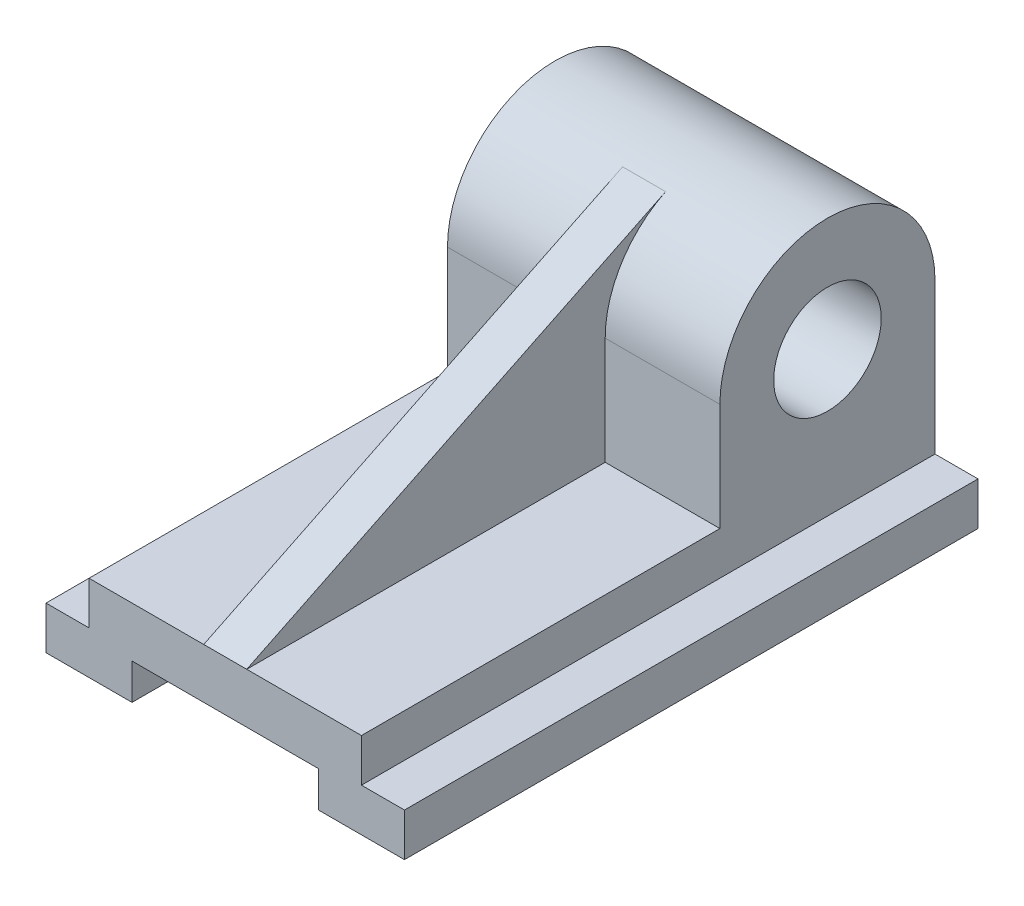
ISO-10303-21;
HEADER;
FILE_DESCRIPTION(('STEP AP214'),'2;1');
FILE_NAME('part.step','',(''),(''),'','','');
FILE_SCHEMA(('AUTOMOTIVE_DESIGN { 1 0 10303 214 1 1 1 1 }'));
ENDSEC;
DATA;
#1=APPLICATION_CONTEXT('core data for automotive mechanical design processes');
#2=APPLICATION_PROTOCOL_DEFINITION('international standard','automotive_design',2000,#1);
#3=PRODUCT_CONTEXT('',#1,'mechanical');
#4=PRODUCT('Part','Part','',(#3));
#5=PRODUCT_RELATED_PRODUCT_CATEGORY('part','',(#4));
#6=PRODUCT_DEFINITION_FORMATION('','',#4);
#7=PRODUCT_DEFINITION_CONTEXT('part definition',#1,'design');
#8=PRODUCT_DEFINITION('design','',#6,#7);
#9=PRODUCT_DEFINITION_SHAPE('','',#8);
#10=(LENGTH_UNIT() NAMED_UNIT(*) SI_UNIT(.MILLI.,.METRE.));
#11=(NAMED_UNIT(*) PLANE_ANGLE_UNIT() SI_UNIT($,.RADIAN.));
#12=(NAMED_UNIT(*) SI_UNIT($,.STERADIAN.) SOLID_ANGLE_UNIT());
#13=UNCERTAINTY_MEASURE_WITH_UNIT(LENGTH_MEASURE(1.E-05),#10,'distance_accuracy_value','');
#14=(GEOMETRIC_REPRESENTATION_CONTEXT(3) GLOBAL_UNCERTAINTY_ASSIGNED_CONTEXT((#13)) GLOBAL_UNIT_ASSIGNED_CONTEXT((#10,
#11,#12)) REPRESENTATION_CONTEXT('',''));
#15=CARTESIAN_POINT('',(0.,0.,0.));
#16=DIRECTION('',(0.,0.,1.));
#17=DIRECTION('',(1.,0.,0.));
#18=AXIS2_PLACEMENT_3D('',#15,#16,#17);
#19=CARTESIAN_POINT('',(-50.,12.,160.));
#20=DIRECTION('',(0.,-1.,0.));
#21=DIRECTION('',(0.,0.,-1.));
#22=AXIS2_PLACEMENT_3D('',#19,#20,#21);
#23=PLANE('',#22);
#24=DIRECTION('',(0.,0.,1.));
#25=VECTOR('',#24,1.);
#26=CARTESIAN_POINT('',(-6.,12.,160.));
#27=LINE('',#26,#25);
#28=CARTESIAN_POINT('',(-6.,12.,60.));
#29=VERTEX_POINT('',#28);
#30=CARTESIAN_POINT('',(-6.,12.,160.));
#31=VERTEX_POINT('',#30);
#32=EDGE_CURVE('E177',#29,#31,#27,.T.);
#33=ORIENTED_EDGE('',*,*,#32,.F.);
#34=DIRECTION('',(1.,0.,0.));
#35=VECTOR('',#34,1.);
#36=CARTESIAN_POINT('',(-38.,12.,60.));
#37=LINE('',#36,#35);
#38=CARTESIAN_POINT('',(-38.,12.,60.));
#39=VERTEX_POINT('',#38);
#40=EDGE_CURVE('E164',#39,#29,#37,.T.);
#41=ORIENTED_EDGE('',*,*,#40,.F.);
#42=DIRECTION('',(0.,0.,1.));
#43=VECTOR('',#42,1.);
#44=CARTESIAN_POINT('',(-38.,12.,0.));
#45=LINE('',#44,#43);
#46=CARTESIAN_POINT('',(-38.,12.,160.));
#47=VERTEX_POINT('',#46);
#48=EDGE_CURVE('E242',#39,#47,#45,.T.);
#49=ORIENTED_EDGE('',*,*,#48,.T.);
#50=DIRECTION('',(-1.,0.,0.));
#51=VECTOR('',#50,1.);
#52=CARTESIAN_POINT('',(-50.,12.,160.));
#53=LINE('',#52,#51);
#54=EDGE_CURVE('E179',#31,#47,#53,.T.);
#55=ORIENTED_EDGE('',*,*,#54,.F.);
#56=EDGE_LOOP('',(#33,#41,#49,#55));
#57=FACE_BOUND('',#56,.T.);
#58=ADVANCED_FACE('F41',(#57),#23,.F.);
#59=CARTESIAN_POINT('',(-38.,72.,60.));
#60=DIRECTION('',(0.,0.,-1.));
#61=DIRECTION('',(-1.,0.,0.));
#62=AXIS2_PLACEMENT_3D('',#59,#60,#61);
#63=PLANE('',#62);
#64=DIRECTION('',(0.,-1.,0.));
#65=VECTOR('',#64,1.);
#66=CARTESIAN_POINT('',(-6.,72.,60.));
#67=LINE('',#66,#65);
#68=CARTESIAN_POINT('',(-6.,42.,60.));
#69=VERTEX_POINT('',#68);
#70=EDGE_CURVE('E166',#69,#29,#67,.T.);
#71=ORIENTED_EDGE('',*,*,#70,.F.);
#72=DIRECTION('',(-1.,0.,0.));
#73=VECTOR('',#72,1.);
#74=CARTESIAN_POINT('',(38.,42.,60.));
#75=LINE('',#74,#73);
#76=CARTESIAN_POINT('',(-38.,42.,60.));
#77=VERTEX_POINT('',#76);
#78=EDGE_CURVE('E297',#69,#77,#75,.T.);
#79=ORIENTED_EDGE('',*,*,#78,.T.);
#80=DIRECTION('',(0.,-1.,0.));
#81=VECTOR('',#80,1.);
#82=CARTESIAN_POINT('',(-38.,72.,60.));
#83=LINE('',#82,#81);
#84=EDGE_CURVE('E172',#77,#39,#83,.T.);
#85=ORIENTED_EDGE('',*,*,#84,.T.);
#86=ORIENTED_EDGE('',*,*,#40,.T.);
#87=EDGE_LOOP('',(#71,#79,#85,#86));
#88=FACE_BOUND('',#87,.T.);
#89=ADVANCED_FACE('F170',(#88),#63,.F.);
#90=CARTESIAN_POINT('',(38.,42.,30.));
#91=DIRECTION('',(1.,0.,0.));
#92=DIRECTION('',(0.,0.,-1.));
#93=AXIS2_PLACEMENT_3D('',#90,#91,#92);
#94=CYLINDRICAL_SURFACE('',#93,30.);
#95=CARTESIAN_POINT('',(38.,42.,30.));
#96=DIRECTION('',(-1.,0.,0.));
#97=DIRECTION('',(0.,0.,1.));
#98=AXIS2_PLACEMENT_3D('',#95,#96,#97);
#99=CIRCLE('',#98,30.);
#100=CARTESIAN_POINT('',(38.,42.,0.));
#101=VERTEX_POINT('',#100);
#102=CARTESIAN_POINT('',(38.,42.,60.));
#103=VERTEX_POINT('',#102);
#104=EDGE_CURVE('E51',#101,#103,#99,.F.);
#105=ORIENTED_EDGE('',*,*,#104,.F.);
#106=DIRECTION('',(-1.,0.,0.));
#107=VECTOR('',#106,1.);
#108=CARTESIAN_POINT('',(38.,42.,0.));
#109=LINE('',#108,#107);
#110=CARTESIAN_POINT('',(-38.,42.,0.));
#111=VERTEX_POINT('',#110);
#112=EDGE_CURVE('E298',#111,#101,#109,.F.);
#113=ORIENTED_EDGE('',*,*,#112,.F.);
#114=CARTESIAN_POINT('',(-38.,42.,30.));
#115=DIRECTION('',(1.,0.,0.));
#116=DIRECTION('',(0.,0.,-1.));
#117=AXIS2_PLACEMENT_3D('',#114,#115,#116);
#118=CIRCLE('',#117,30.);
#119=EDGE_CURVE('E11',#77,#111,#118,.F.);
#120=ORIENTED_EDGE('',*,*,#119,.F.);
#121=ORIENTED_EDGE('',*,*,#78,.F.);
#122=CARTESIAN_POINT('',(-6.,42.,30.));
#123=DIRECTION('',(1.,0.,0.));
#124=DIRECTION('',(0.,0.,-1.));
#125=AXIS2_PLACEMENT_3D('',#122,#123,#124);
#126=CIRCLE('',#125,30.);
#127=CARTESIAN_POINT('',(-6.,68.9662921348059,43.1460674157097));
#128=VERTEX_POINT('',#127);
#129=EDGE_CURVE('E65',#69,#128,#126,.F.);
#130=ORIENTED_EDGE('',*,*,#129,.T.);
#131=DIRECTION('',(1.,0.,0.));
#132=VECTOR('',#131,1.);
#133=CARTESIAN_POINT('',(38.,68.9662921348203,43.1460674157167));
#134=LINE('',#133,#132);
#135=CARTESIAN_POINT('',(6.,68.9662921348059,43.1460674157097));
#136=VERTEX_POINT('',#135);
#137=EDGE_CURVE('E59',#128,#136,#134,.T.);
#138=ORIENTED_EDGE('',*,*,#137,.T.);
#139=CARTESIAN_POINT('',(6.,42.,30.));
#140=DIRECTION('',(1.,0.,0.));
#141=DIRECTION('',(0.,0.,-1.));
#142=AXIS2_PLACEMENT_3D('',#139,#140,#141);
#143=CIRCLE('',#142,30.);
#144=CARTESIAN_POINT('',(6.,42.,60.));
#145=VERTEX_POINT('',#144);
#146=EDGE_CURVE('E200',#145,#136,#143,.F.);
#147=ORIENTED_EDGE('',*,*,#146,.F.);
#148=EDGE_CURVE('E299',#103,#145,#75,.T.);
#149=ORIENTED_EDGE('',*,*,#148,.F.);
#150=EDGE_LOOP('',(#105,#113,#120,#121,#130,#138,#147,#149));
#151=FACE_BOUND('',#150,.T.);
#152=ADVANCED_FACE('F42',(#151),#94,.T.);
#153=CARTESIAN_POINT('',(6.,12.,60.));
#154=VERTEX_POINT('',#153);
#155=CARTESIAN_POINT('',(38.,12.,60.));
#156=VERTEX_POINT('',#155);
#157=EDGE_CURVE('E176',#154,#156,#37,.T.);
#158=ORIENTED_EDGE('',*,*,#157,.F.);
#159=DIRECTION('',(0.,0.,1.));
#160=VECTOR('',#159,1.);
#161=CARTESIAN_POINT('',(6.,12.,160.));
#162=LINE('',#161,#160);
#163=CARTESIAN_POINT('',(6.,12.,160.));
#164=VERTEX_POINT('',#163);
#165=EDGE_CURVE('E197',#154,#164,#162,.T.);
#166=ORIENTED_EDGE('',*,*,#165,.T.);
#167=CARTESIAN_POINT('',(38.,12.,160.));
#168=VERTEX_POINT('',#167);
#169=EDGE_CURVE('E272',#168,#164,#53,.T.);
#170=ORIENTED_EDGE('',*,*,#169,.F.);
#171=DIRECTION('',(0.,0.,1.));
#172=VECTOR('',#171,1.);
#173=CARTESIAN_POINT('',(38.,12.,0.));
#174=LINE('',#173,#172);
#175=EDGE_CURVE('E255',#156,#168,#174,.T.);
#176=ORIENTED_EDGE('',*,*,#175,.F.);
#177=EDGE_LOOP('',(#158,#166,#170,#176));
#178=FACE_BOUND('',#177,.T.);
#179=ADVANCED_FACE('F336',(#178),#23,.F.);
#180=CARTESIAN_POINT('',(-50.,12.,160.));
#181=DIRECTION('',(1.,0.,0.));
#182=DIRECTION('',(0.,1.,0.));
#183=AXIS2_PLACEMENT_3D('',#180,#181,#182);
#184=PLANE('',#183);
#185=DIRECTION('',(0.,0.,1.));
#186=VECTOR('',#185,1.);
#187=CARTESIAN_POINT('',(-50.,0.,0.));
#188=LINE('',#187,#186);
#189=CARTESIAN_POINT('',(-50.,0.,0.));
#190=VERTEX_POINT('',#189);
#191=CARTESIAN_POINT('',(-50.,0.,160.));
#192=VERTEX_POINT('',#191);
#193=EDGE_CURVE('E237',#190,#192,#188,.T.);
#194=ORIENTED_EDGE('',*,*,#193,.F.);
#195=DIRECTION('',(0.,-1.,0.));
#196=VECTOR('',#195,1.);
#197=CARTESIAN_POINT('',(-50.,12.,0.));
#198=LINE('',#197,#196);
#199=CARTESIAN_POINT('',(-50.,-12.,0.));
#200=VERTEX_POINT('',#199);
#201=EDGE_CURVE('E286',#190,#200,#198,.T.);
#202=ORIENTED_EDGE('',*,*,#201,.T.);
#203=DIRECTION('',(0.,0.,-1.));
#204=VECTOR('',#203,1.);
#205=CARTESIAN_POINT('',(-50.,-12.,160.));
#206=LINE('',#205,#204);
#207=CARTESIAN_POINT('',(-50.,-12.,160.));
#208=VERTEX_POINT('',#207);
#209=EDGE_CURVE('E291',#208,#200,#206,.T.);
#210=ORIENTED_EDGE('',*,*,#209,.F.);
#211=DIRECTION('',(0.,-1.,0.));
#212=VECTOR('',#211,1.);
#213=CARTESIAN_POINT('',(-50.,12.,160.));
#214=LINE('',#213,#212);
#215=EDGE_CURVE('E277',#192,#208,#214,.T.);
#216=ORIENTED_EDGE('',*,*,#215,.F.);
#217=EDGE_LOOP('',(#194,#202,#210,#216));
#218=FACE_BOUND('',#217,.T.);
#219=ADVANCED_FACE('F347',(#218),#184,.F.);
#220=CARTESIAN_POINT('',(-50.,-12.,160.));
#221=DIRECTION('',(0.,1.,0.));
#222=DIRECTION('',(0.,0.,1.));
#223=AXIS2_PLACEMENT_3D('',#220,#221,#222);
#224=PLANE('',#223);
#225=DIRECTION('',(0.,0.,1.));
#226=VECTOR('',#225,1.);
#227=CARTESIAN_POINT('',(26.,-12.,0.));
#228=LINE('',#227,#226);
#229=CARTESIAN_POINT('',(26.,-12.,0.));
#230=VERTEX_POINT('',#229);
#231=CARTESIAN_POINT('',(26.,-12.,160.));
#232=VERTEX_POINT('',#231);
#233=EDGE_CURVE('E235',#230,#232,#228,.T.);
#234=ORIENTED_EDGE('',*,*,#233,.F.);
#235=DIRECTION('',(1.,0.,0.));
#236=VECTOR('',#235,1.);
#237=CARTESIAN_POINT('',(-50.,-12.,0.));
#238=LINE('',#237,#236);
#239=CARTESIAN_POINT('',(50.,-12.,0.));
#240=VERTEX_POINT('',#239);
#241=EDGE_CURVE('E288',#230,#240,#238,.T.);
#242=ORIENTED_EDGE('',*,*,#241,.T.);
#243=DIRECTION('',(0.,0.,-1.));
#244=VECTOR('',#243,1.);
#245=CARTESIAN_POINT('',(50.,-12.,160.));
#246=LINE('',#245,#244);
#247=CARTESIAN_POINT('',(50.,-12.,160.));
#248=VERTEX_POINT('',#247);
#249=EDGE_CURVE('E285',#248,#240,#246,.T.);
#250=ORIENTED_EDGE('',*,*,#249,.F.);
#251=DIRECTION('',(1.,0.,0.));
#252=VECTOR('',#251,1.);
#253=CARTESIAN_POINT('',(-50.,-12.,160.));
#254=LINE('',#253,#252);
#255=EDGE_CURVE('E276',#232,#248,#254,.T.);
#256=ORIENTED_EDGE('',*,*,#255,.F.);
#257=EDGE_LOOP('',(#234,#242,#250,#256));
#258=FACE_BOUND('',#257,.T.);
#259=ADVANCED_FACE('F354',(#258),#224,.F.);
#260=CARTESIAN_POINT('',(50.,12.,160.));
#261=DIRECTION('',(-1.,0.,0.));
#262=DIRECTION('',(0.,-1.,0.));
#263=AXIS2_PLACEMENT_3D('',#260,#261,#262);
#264=PLANE('',#263);
#265=DIRECTION('',(0.,1.,0.));
#266=VECTOR('',#265,1.);
#267=CARTESIAN_POINT('',(50.,12.,0.));
#268=LINE('',#267,#266);
#269=CARTESIAN_POINT('',(50.,0.,0.));
#270=VERTEX_POINT('',#269);
#271=EDGE_CURVE('E226',#240,#270,#268,.T.);
#272=ORIENTED_EDGE('',*,*,#271,.T.);
#273=DIRECTION('',(0.,0.,1.));
#274=VECTOR('',#273,1.);
#275=CARTESIAN_POINT('',(50.,0.,0.));
#276=LINE('',#275,#274);
#277=CARTESIAN_POINT('',(50.,0.,160.));
#278=VERTEX_POINT('',#277);
#279=EDGE_CURVE('E208',#270,#278,#276,.T.);
#280=ORIENTED_EDGE('',*,*,#279,.T.);
#281=DIRECTION('',(0.,1.,0.));
#282=VECTOR('',#281,1.);
#283=CARTESIAN_POINT('',(50.,12.,160.));
#284=LINE('',#283,#282);
#285=EDGE_CURVE('E267',#248,#278,#284,.T.);
#286=ORIENTED_EDGE('',*,*,#285,.F.);
#287=ORIENTED_EDGE('',*,*,#249,.T.);
#288=EDGE_LOOP('',(#272,#280,#286,#287));
#289=FACE_BOUND('',#288,.T.);
#290=ADVANCED_FACE('F432',(#289),#264,.F.);
#291=CARTESIAN_POINT('',(-26.,-12.,0.));
#292=VERTEX_POINT('',#291);
#293=EDGE_CURVE('E275',#200,#292,#238,.T.);
#294=ORIENTED_EDGE('',*,*,#293,.T.);
#295=DIRECTION('',(0.,0.,1.));
#296=VECTOR('',#295,1.);
#297=CARTESIAN_POINT('',(-26.,-12.,0.));
#298=LINE('',#297,#296);
#299=CARTESIAN_POINT('',(-26.,-12.,160.));
#300=VERTEX_POINT('',#299);
#301=EDGE_CURVE('E217',#292,#300,#298,.T.);
#302=ORIENTED_EDGE('',*,*,#301,.T.);
#303=EDGE_CURVE('E278',#208,#300,#254,.T.);
#304=ORIENTED_EDGE('',*,*,#303,.F.);
#305=ORIENTED_EDGE('',*,*,#209,.T.);
#306=EDGE_LOOP('',(#294,#302,#304,#305));
#307=FACE_BOUND('',#306,.T.);
#308=ADVANCED_FACE('F413',(#307),#224,.F.);
#309=CARTESIAN_POINT('',(0.,0.,160.));
#310=DIRECTION('',(0.,0.,1.));
#311=DIRECTION('',(1.,0.,0.));
#312=AXIS2_PLACEMENT_3D('',#309,#310,#311);
#313=PLANE('',#312);
#314=ORIENTED_EDGE('',*,*,#169,.T.);
#315=EDGE_CURVE('E280',#164,#31,#53,.T.);
#316=ORIENTED_EDGE('',*,*,#315,.T.);
#317=ORIENTED_EDGE('',*,*,#54,.T.);
#318=DIRECTION('',(0.,1.,0.));
#319=VECTOR('',#318,1.);
#320=CARTESIAN_POINT('',(-38.,12.,160.));
#321=LINE('',#320,#319);
#322=CARTESIAN_POINT('',(-38.,0.,160.));
#323=VERTEX_POINT('',#322);
#324=EDGE_CURVE('E241',#323,#47,#321,.T.);
#325=ORIENTED_EDGE('',*,*,#324,.F.);
#326=DIRECTION('',(1.,0.,0.));
#327=VECTOR('',#326,1.);
#328=CARTESIAN_POINT('',(-50.,0.,160.));
#329=LINE('',#328,#327);
#330=EDGE_CURVE('E225',#192,#323,#329,.T.);
#331=ORIENTED_EDGE('',*,*,#330,.F.);
#332=ORIENTED_EDGE('',*,*,#215,.T.);
#333=ORIENTED_EDGE('',*,*,#303,.T.);
#334=DIRECTION('',(0.,-1.,0.));
#335=VECTOR('',#334,1.);
#336=CARTESIAN_POINT('',(-26.,-12.,160.));
#337=LINE('',#336,#335);
#338=CARTESIAN_POINT('',(-26.,-2.,160.));
#339=VERTEX_POINT('',#338);
#340=EDGE_CURVE('E218',#339,#300,#337,.T.);
#341=ORIENTED_EDGE('',*,*,#340,.F.);
#342=DIRECTION('',(-1.,0.,0.));
#343=VECTOR('',#342,1.);
#344=CARTESIAN_POINT('',(-26.,-2.,160.));
#345=LINE('',#344,#343);
#346=CARTESIAN_POINT('',(26.,-2.,160.));
#347=VERTEX_POINT('',#346);
#348=EDGE_CURVE('E213',#347,#339,#345,.T.);
#349=ORIENTED_EDGE('',*,*,#348,.F.);
#350=DIRECTION('',(0.,1.,0.));
#351=VECTOR('',#350,1.);
#352=CARTESIAN_POINT('',(26.,-12.,160.));
#353=LINE('',#352,#351);
#354=EDGE_CURVE('E222',#232,#347,#353,.T.);
#355=ORIENTED_EDGE('',*,*,#354,.F.);
#356=ORIENTED_EDGE('',*,*,#255,.T.);
#357=ORIENTED_EDGE('',*,*,#285,.T.);
#358=DIRECTION('',(1.,0.,0.));
#359=VECTOR('',#358,1.);
#360=CARTESIAN_POINT('',(50.,0.,160.));
#361=LINE('',#360,#359);
#362=CARTESIAN_POINT('',(38.,0.,160.));
#363=VERTEX_POINT('',#362);
#364=EDGE_CURVE('E261',#363,#278,#361,.T.);
#365=ORIENTED_EDGE('',*,*,#364,.F.);
#366=DIRECTION('',(0.,-1.,0.));
#367=VECTOR('',#366,1.);
#368=CARTESIAN_POINT('',(38.,12.,160.));
#369=LINE('',#368,#367);
#370=EDGE_CURVE('E245',#168,#363,#369,.T.);
#371=ORIENTED_EDGE('',*,*,#370,.F.);
#372=EDGE_LOOP('',(#314,#316,#317,#325,#331,#332,#333,#341,#349,#355,#356,#357,#365,#371));
#373=FACE_BOUND('',#372,.T.);
#374=ADVANCED_FACE('F399',(#373),#313,.T.);
#375=CARTESIAN_POINT('',(0.,0.,0.));
#376=DIRECTION('',(0.,0.,1.));
#377=DIRECTION('',(1.,0.,0.));
#378=AXIS2_PLACEMENT_3D('',#375,#376,#377);
#379=PLANE('',#378);
#380=DIRECTION('',(-1.,0.,0.));
#381=VECTOR('',#380,1.);
#382=CARTESIAN_POINT('',(-26.,-2.,0.));
#383=LINE('',#382,#381);
#384=CARTESIAN_POINT('',(26.,-2.,0.));
#385=VERTEX_POINT('',#384);
#386=CARTESIAN_POINT('',(-26.,-2.,0.));
#387=VERTEX_POINT('',#386);
#388=EDGE_CURVE('E216',#385,#387,#383,.T.);
#389=ORIENTED_EDGE('',*,*,#388,.T.);
#390=DIRECTION('',(0.,-1.,0.));
#391=VECTOR('',#390,1.);
#392=CARTESIAN_POINT('',(-26.,-12.,0.));
#393=LINE('',#392,#391);
#394=EDGE_CURVE('E207',#387,#292,#393,.T.);
#395=ORIENTED_EDGE('',*,*,#394,.T.);
#396=ORIENTED_EDGE('',*,*,#293,.F.);
#397=ORIENTED_EDGE('',*,*,#201,.F.);
#398=DIRECTION('',(1.,0.,0.));
#399=VECTOR('',#398,1.);
#400=CARTESIAN_POINT('',(-50.,0.,0.));
#401=LINE('',#400,#399);
#402=CARTESIAN_POINT('',(-38.,0.,0.));
#403=VERTEX_POINT('',#402);
#404=EDGE_CURVE('E250',#190,#403,#401,.T.);
#405=ORIENTED_EDGE('',*,*,#404,.T.);
#406=DIRECTION('',(0.,1.,0.));
#407=VECTOR('',#406,1.);
#408=CARTESIAN_POINT('',(-38.,12.,0.));
#409=LINE('',#408,#407);
#410=EDGE_CURVE('E236',#403,#111,#409,.T.);
#411=ORIENTED_EDGE('',*,*,#410,.T.);
#412=ORIENTED_EDGE('',*,*,#112,.T.);
#413=DIRECTION('',(0.,-1.,0.));
#414=VECTOR('',#413,1.);
#415=CARTESIAN_POINT('',(38.,12.,0.));
#416=LINE('',#415,#414);
#417=CARTESIAN_POINT('',(38.,0.,0.));
#418=VERTEX_POINT('',#417);
#419=EDGE_CURVE('E263',#101,#418,#416,.T.);
#420=ORIENTED_EDGE('',*,*,#419,.T.);
#421=DIRECTION('',(1.,0.,0.));
#422=VECTOR('',#421,1.);
#423=CARTESIAN_POINT('',(50.,0.,0.));
#424=LINE('',#423,#422);
#425=EDGE_CURVE('E258',#418,#270,#424,.T.);
#426=ORIENTED_EDGE('',*,*,#425,.T.);
#427=ORIENTED_EDGE('',*,*,#271,.F.);
#428=ORIENTED_EDGE('',*,*,#241,.F.);
#429=DIRECTION('',(0.,1.,0.));
#430=VECTOR('',#429,1.);
#431=CARTESIAN_POINT('',(26.,-12.,0.));
#432=LINE('',#431,#430);
#433=EDGE_CURVE('E215',#230,#385,#432,.T.);
#434=ORIENTED_EDGE('',*,*,#433,.T.);
#435=EDGE_LOOP('',(#389,#395,#396,#397,#405,#411,#412,#420,#426,#427,#428,#434));
#436=FACE_BOUND('',#435,.T.);
#437=ADVANCED_FACE('F438',(#436),#379,.F.);
#438=CARTESIAN_POINT('',(-26.,-12.,0.));
#439=DIRECTION('',(-1.,0.,0.));
#440=DIRECTION('',(0.,-1.,0.));
#441=AXIS2_PLACEMENT_3D('',#438,#439,#440);
#442=PLANE('',#441);
#443=ORIENTED_EDGE('',*,*,#340,.T.);
#444=ORIENTED_EDGE('',*,*,#301,.F.);
#445=ORIENTED_EDGE('',*,*,#394,.F.);
#446=DIRECTION('',(0.,0.,1.));
#447=VECTOR('',#446,1.);
#448=CARTESIAN_POINT('',(-26.,-2.,0.));
#449=LINE('',#448,#447);
#450=EDGE_CURVE('E227',#387,#339,#449,.T.);
#451=ORIENTED_EDGE('',*,*,#450,.T.);
#452=EDGE_LOOP('',(#443,#444,#445,#451));
#453=FACE_BOUND('',#452,.T.);
#454=ADVANCED_FACE('F416',(#453),#442,.F.);
#455=CARTESIAN_POINT('',(-26.,-2.,0.));
#456=DIRECTION('',(0.,1.,0.));
#457=DIRECTION('',(0.,0.,1.));
#458=AXIS2_PLACEMENT_3D('',#455,#456,#457);
#459=PLANE('',#458);
#460=ORIENTED_EDGE('',*,*,#348,.T.);
#461=ORIENTED_EDGE('',*,*,#450,.F.);
#462=ORIENTED_EDGE('',*,*,#388,.F.);
#463=DIRECTION('',(0.,0.,1.));
#464=VECTOR('',#463,1.);
#465=CARTESIAN_POINT('',(26.,-2.,0.));
#466=LINE('',#465,#464);
#467=EDGE_CURVE('E228',#385,#347,#466,.T.);
#468=ORIENTED_EDGE('',*,*,#467,.T.);
#469=EDGE_LOOP('',(#460,#461,#462,#468));
#470=FACE_BOUND('',#469,.T.);
#471=ADVANCED_FACE('F421',(#470),#459,.F.);
#472=CARTESIAN_POINT('',(26.,-12.,0.));
#473=DIRECTION('',(1.,0.,0.));
#474=DIRECTION('',(0.,1.,0.));
#475=AXIS2_PLACEMENT_3D('',#472,#473,#474);
#476=PLANE('',#475);
#477=ORIENTED_EDGE('',*,*,#354,.T.);
#478=ORIENTED_EDGE('',*,*,#467,.F.);
#479=ORIENTED_EDGE('',*,*,#433,.F.);
#480=ORIENTED_EDGE('',*,*,#233,.T.);
#481=EDGE_LOOP('',(#477,#478,#479,#480));
#482=FACE_BOUND('',#481,.T.);
#483=ADVANCED_FACE('F422',(#482),#476,.F.);
#484=CARTESIAN_POINT('',(50.,0.,0.));
#485=DIRECTION('',(0.,-1.,0.));
#486=DIRECTION('',(1.,0.,0.));
#487=AXIS2_PLACEMENT_3D('',#484,#485,#486);
#488=PLANE('',#487);
#489=ORIENTED_EDGE('',*,*,#364,.T.);
#490=ORIENTED_EDGE('',*,*,#279,.F.);
#491=ORIENTED_EDGE('',*,*,#425,.F.);
#492=DIRECTION('',(0.,0.,1.));
#493=VECTOR('',#492,1.);
#494=CARTESIAN_POINT('',(38.,0.,0.));
#495=LINE('',#494,#493);
#496=EDGE_CURVE('E260',#418,#363,#495,.T.);
#497=ORIENTED_EDGE('',*,*,#496,.T.);
#498=EDGE_LOOP('',(#489,#490,#491,#497));
#499=FACE_BOUND('',#498,.T.);
#500=ADVANCED_FACE('F436',(#499),#488,.F.);
#501=CARTESIAN_POINT('',(38.,12.,0.));
#502=DIRECTION('',(-1.,0.,0.));
#503=DIRECTION('',(0.,0.,1.));
#504=AXIS2_PLACEMENT_3D('',#501,#502,#503);
#505=PLANE('',#504);
#506=CARTESIAN_POINT('',(38.,40.3235159401776,30.));
#507=DIRECTION('',(1.,0.,0.));
#508=DIRECTION('',(0.,0.,-1.));
#509=AXIS2_PLACEMENT_3D('',#506,#507,#508);
#510=CIRCLE('',#509,15.);
#511=CARTESIAN_POINT('',(38.,40.3235159401776,15.));
#512=VERTEX_POINT('',#511);
#513=EDGE_CURVE('E205',#512,#512,#510,.T.);
#514=ORIENTED_EDGE('',*,*,#513,.F.);
#515=EDGE_LOOP('',(#514));
#516=FACE_BOUND('',#515,.T.);
#517=ORIENTED_EDGE('',*,*,#419,.F.);
#518=ORIENTED_EDGE('',*,*,#104,.T.);
#519=DIRECTION('',(0.,-1.,0.));
#520=VECTOR('',#519,1.);
#521=CARTESIAN_POINT('',(38.,72.,60.));
#522=LINE('',#521,#520);
#523=EDGE_CURVE('E173',#103,#156,#522,.T.);
#524=ORIENTED_EDGE('',*,*,#523,.T.);
#525=ORIENTED_EDGE('',*,*,#175,.T.);
#526=ORIENTED_EDGE('',*,*,#370,.T.);
#527=ORIENTED_EDGE('',*,*,#496,.F.);
#528=EDGE_LOOP('',(#517,#518,#524,#525,#526,#527));
#529=FACE_BOUND('',#528,.T.);
#530=ADVANCED_FACE('F308',(#516,#529),#505,.F.);
#531=CARTESIAN_POINT('',(-38.,12.,0.));
#532=DIRECTION('',(1.,0.,0.));
#533=DIRECTION('',(0.,0.,-1.));
#534=AXIS2_PLACEMENT_3D('',#531,#532,#533);
#535=PLANE('',#534);
#536=CARTESIAN_POINT('',(-38.,40.3235159401776,30.));
#537=DIRECTION('',(1.,0.,0.));
#538=DIRECTION('',(0.,0.,-1.));
#539=AXIS2_PLACEMENT_3D('',#536,#537,#538);
#540=CIRCLE('',#539,15.);
#541=CARTESIAN_POINT('',(-38.,40.3235159401776,15.));
#542=VERTEX_POINT('',#541);
#543=EDGE_CURVE('E46',#542,#542,#540,.T.);
#544=ORIENTED_EDGE('',*,*,#543,.T.);
#545=EDGE_LOOP('',(#544));
#546=FACE_BOUND('',#545,.T.);
#547=ORIENTED_EDGE('',*,*,#84,.F.);
#548=ORIENTED_EDGE('',*,*,#119,.T.);
#549=ORIENTED_EDGE('',*,*,#410,.F.);
#550=DIRECTION('',(0.,0.,1.));
#551=VECTOR('',#550,1.);
#552=CARTESIAN_POINT('',(-38.,0.,0.));
#553=LINE('',#552,#551);
#554=EDGE_CURVE('E239',#403,#323,#553,.T.);
#555=ORIENTED_EDGE('',*,*,#554,.T.);
#556=ORIENTED_EDGE('',*,*,#324,.T.);
#557=ORIENTED_EDGE('',*,*,#48,.F.);
#558=EDGE_LOOP('',(#547,#548,#549,#555,#556,#557));
#559=FACE_BOUND('',#558,.T.);
#560=ADVANCED_FACE('F319',(#546,#559),#535,.F.);
#561=CARTESIAN_POINT('',(-50.,0.,0.));
#562=DIRECTION('',(0.,-1.,0.));
#563=DIRECTION('',(0.,0.,-1.));
#564=AXIS2_PLACEMENT_3D('',#561,#562,#563);
#565=PLANE('',#564);
#566=ORIENTED_EDGE('',*,*,#330,.T.);
#567=ORIENTED_EDGE('',*,*,#554,.F.);
#568=ORIENTED_EDGE('',*,*,#404,.F.);
#569=ORIENTED_EDGE('',*,*,#193,.T.);
#570=EDGE_LOOP('',(#566,#567,#568,#569));
#571=FACE_BOUND('',#570,.T.);
#572=ADVANCED_FACE('F333',(#571),#565,.F.);
#573=ORIENTED_EDGE('',*,*,#148,.T.);
#574=DIRECTION('',(0.,-1.,0.));
#575=VECTOR('',#574,1.);
#576=CARTESIAN_POINT('',(6.,72.,60.));
#577=LINE('',#576,#575);
#578=EDGE_CURVE('E194',#145,#154,#577,.T.);
#579=ORIENTED_EDGE('',*,*,#578,.T.);
#580=ORIENTED_EDGE('',*,*,#157,.T.);
#581=ORIENTED_EDGE('',*,*,#523,.F.);
#582=EDGE_LOOP('',(#573,#579,#580,#581));
#583=FACE_BOUND('',#582,.T.);
#584=ADVANCED_FACE('F311',(#583),#63,.F.);
#585=CARTESIAN_POINT('',(-50.,40.3235159401776,30.));
#586=DIRECTION('',(1.,0.,0.));
#587=DIRECTION('',(0.,0.,-1.));
#588=AXIS2_PLACEMENT_3D('',#585,#586,#587);
#589=CYLINDRICAL_SURFACE('',#588,15.);
#590=ORIENTED_EDGE('',*,*,#513,.T.);
#591=EDGE_LOOP('',(#590));
#592=FACE_BOUND('',#591,.T.);
#593=ORIENTED_EDGE('',*,*,#543,.F.);
#594=EDGE_LOOP('',(#593));
#595=FACE_BOUND('',#594,.T.);
#596=ADVANCED_FACE('F323',(#592,#595),#589,.F.);
#597=CARTESIAN_POINT('',(0.,12.,160.));
#598=DIRECTION('',(0.,-0.89887640449449,-0.43820224719079));
#599=DIRECTION('',(0.,0.43820224719079,-0.89887640449449));
#600=AXIS2_PLACEMENT_3D('',#597,#598,#599);
#601=PLANE('',#600);
#602=ORIENTED_EDGE('',*,*,#137,.F.);
#603=DIRECTION('',(0.,0.43820224719079,-0.89887640449449));
#604=VECTOR('',#603,1.);
#605=CARTESIAN_POINT('',(-6.,12.,160.));
#606=LINE('',#605,#604);
#607=EDGE_CURVE('E188',#31,#128,#606,.T.);
#608=ORIENTED_EDGE('',*,*,#607,.F.);
#609=ORIENTED_EDGE('',*,*,#315,.F.);
#610=DIRECTION('',(0.,0.43820224719079,-0.89887640449449));
#611=VECTOR('',#610,1.);
#612=CARTESIAN_POINT('',(6.,12.,160.));
#613=LINE('',#612,#611);
#614=EDGE_CURVE('E189',#164,#136,#613,.T.);
#615=ORIENTED_EDGE('',*,*,#614,.T.);
#616=EDGE_LOOP('',(#602,#608,#609,#615));
#617=FACE_BOUND('',#616,.T.);
#618=ADVANCED_FACE('F324',(#617),#601,.F.);
#619=CARTESIAN_POINT('',(6.,30.,80.));
#620=DIRECTION('',(1.,0.,0.));
#621=DIRECTION('',(0.,0.,-1.));
#622=AXIS2_PLACEMENT_3D('',#619,#620,#621);
#623=PLANE('',#622);
#624=ORIENTED_EDGE('',*,*,#578,.F.);
#625=ORIENTED_EDGE('',*,*,#146,.T.);
#626=ORIENTED_EDGE('',*,*,#614,.F.);
#627=ORIENTED_EDGE('',*,*,#165,.F.);
#628=EDGE_LOOP('',(#624,#625,#626,#627));
#629=FACE_BOUND('',#628,.T.);
#630=ADVANCED_FACE('F335',(#629),#623,.T.);
#631=CARTESIAN_POINT('',(-6.,30.,80.));
#632=DIRECTION('',(1.,0.,0.));
#633=DIRECTION('',(0.,0.,-1.));
#634=AXIS2_PLACEMENT_3D('',#631,#632,#633);
#635=PLANE('',#634);
#636=ORIENTED_EDGE('',*,*,#129,.F.);
#637=ORIENTED_EDGE('',*,*,#70,.T.);
#638=ORIENTED_EDGE('',*,*,#32,.T.);
#639=ORIENTED_EDGE('',*,*,#607,.T.);
#640=EDGE_LOOP('',(#636,#637,#638,#639));
#641=FACE_BOUND('',#640,.T.);
#642=ADVANCED_FACE('F187',(#641),#635,.F.);
#643=CLOSED_SHELL('',(#58,#89,#152,#179,#219,#259,#290,#308,#374,#437,#454,#471,#483,#500,#530,
#560,#572,#584,#596,#618,#630,#642));
#644=MANIFOLD_SOLID_BREP('B2',#643);
#645=ADVANCED_BREP_SHAPE_REPRESENTATION('',(#18,#644),#14);
#646=SHAPE_DEFINITION_REPRESENTATION(#9,#645);
ENDSEC;
END-ISO-10303-21;
